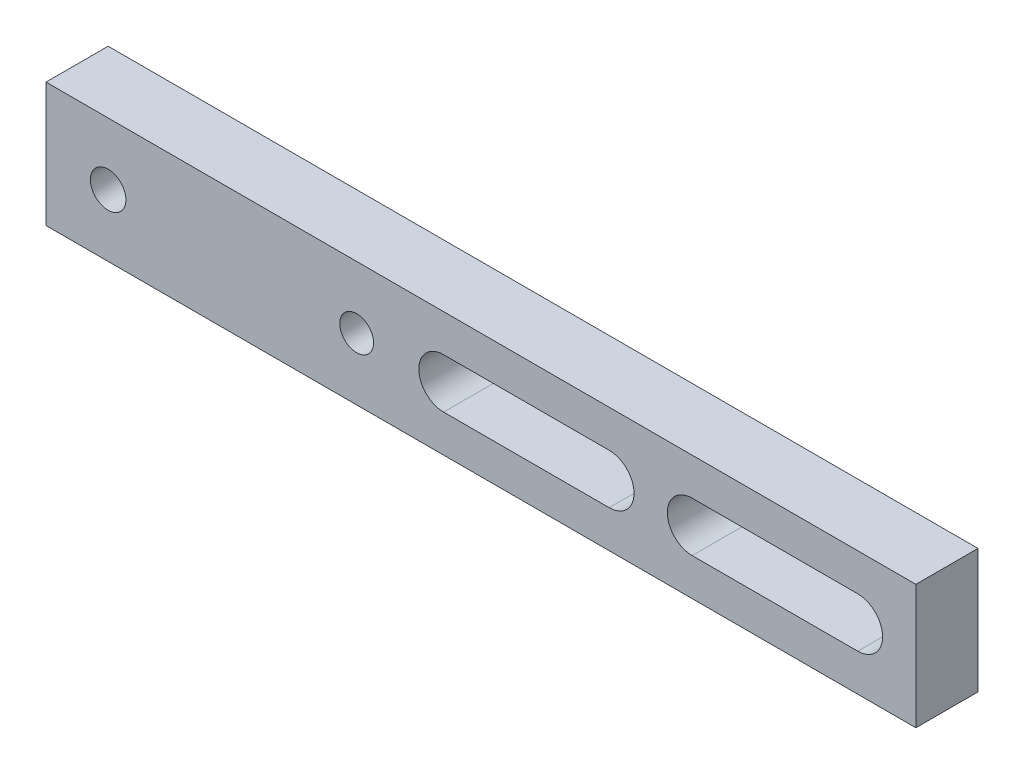
ISO-10303-21;
HEADER;
FILE_DESCRIPTION(('STEP AP214'),'2;1');
FILE_NAME('part.step','',(''),(''),'','','');
FILE_SCHEMA(('AUTOMOTIVE_DESIGN { 1 0 10303 214 1 1 1 1 }'));
ENDSEC;
DATA;
#1=APPLICATION_CONTEXT('core data for automotive mechanical design processes');
#2=APPLICATION_PROTOCOL_DEFINITION('international standard','automotive_design',2000,#1);
#3=PRODUCT_CONTEXT('',#1,'mechanical');
#4=PRODUCT('Part','Part','',(#3));
#5=PRODUCT_RELATED_PRODUCT_CATEGORY('part','',(#4));
#6=PRODUCT_DEFINITION_FORMATION('','',#4);
#7=PRODUCT_DEFINITION_CONTEXT('part definition',#1,'design');
#8=PRODUCT_DEFINITION('design','',#6,#7);
#9=PRODUCT_DEFINITION_SHAPE('','',#8);
#10=(LENGTH_UNIT() NAMED_UNIT(*) SI_UNIT(.MILLI.,.METRE.));
#11=(NAMED_UNIT(*) PLANE_ANGLE_UNIT() SI_UNIT($,.RADIAN.));
#12=(NAMED_UNIT(*) SI_UNIT($,.STERADIAN.) SOLID_ANGLE_UNIT());
#13=UNCERTAINTY_MEASURE_WITH_UNIT(LENGTH_MEASURE(1.E-05),#10,'distance_accuracy_value','');
#14=(GEOMETRIC_REPRESENTATION_CONTEXT(3) GLOBAL_UNCERTAINTY_ASSIGNED_CONTEXT((#13)) GLOBAL_UNIT_ASSIGNED_CONTEXT((#10,
#11,#12)) REPRESENTATION_CONTEXT('',''));
#15=CARTESIAN_POINT('',(0.,0.,0.));
#16=DIRECTION('',(0.,0.,1.));
#17=DIRECTION('',(1.,0.,0.));
#18=AXIS2_PLACEMENT_3D('',#15,#16,#17);
#19=CARTESIAN_POINT('',(-10.2152173913044,18.6358695652173,6.35));
#20=DIRECTION('',(1.,0.,0.));
#21=DIRECTION('',(0.,0.,-1.));
#22=AXIS2_PLACEMENT_3D('',#19,#20,#21);
#23=PLANE('',#22);
#24=DIRECTION('',(0.,-1.,0.));
#25=VECTOR('',#24,1.);
#26=CARTESIAN_POINT('',(-10.2152173913044,18.6358695652173,0.));
#27=LINE('',#26,#25);
#28=CARTESIAN_POINT('',(-10.2152173913044,18.6358695652173,0.));
#29=VERTEX_POINT('',#28);
#30=CARTESIAN_POINT('',(-10.2152173913044,5.93586956521734,0.));
#31=VERTEX_POINT('',#30);
#32=EDGE_CURVE('E162',#29,#31,#27,.T.);
#33=ORIENTED_EDGE('',*,*,#32,.T.);
#34=DIRECTION('',(0.,0.,-1.));
#35=VECTOR('',#34,1.);
#36=CARTESIAN_POINT('',(-10.2152173913044,5.93586956521734,6.35));
#37=LINE('',#36,#35);
#38=CARTESIAN_POINT('',(-10.2152173913044,5.93586956521734,6.35));
#39=VERTEX_POINT('',#38);
#40=EDGE_CURVE('E11',#39,#31,#37,.T.);
#41=ORIENTED_EDGE('',*,*,#40,.F.);
#42=DIRECTION('',(0.,-1.,0.));
#43=VECTOR('',#42,1.);
#44=CARTESIAN_POINT('',(-10.2152173913044,18.6358695652173,6.35));
#45=LINE('',#44,#43);
#46=CARTESIAN_POINT('',(-10.2152173913044,18.6358695652173,6.35));
#47=VERTEX_POINT('',#46);
#48=EDGE_CURVE('E207',#47,#39,#45,.T.);
#49=ORIENTED_EDGE('',*,*,#48,.F.);
#50=DIRECTION('',(0.,0.,-1.));
#51=VECTOR('',#50,1.);
#52=CARTESIAN_POINT('',(-10.2152173913044,18.6358695652173,6.35));
#53=LINE('',#52,#51);
#54=EDGE_CURVE('E217',#47,#29,#53,.T.);
#55=ORIENTED_EDGE('',*,*,#54,.T.);
#56=EDGE_LOOP('',(#33,#41,#49,#55));
#57=FACE_BOUND('',#56,.T.);
#58=ADVANCED_FACE('F37',(#57),#23,.F.);
#59=CARTESIAN_POINT('',(-10.2152173913044,5.93586956521734,6.35));
#60=DIRECTION('',(0.,1.,0.));
#61=DIRECTION('',(0.,0.,1.));
#62=AXIS2_PLACEMENT_3D('',#59,#60,#61);
#63=PLANE('',#62);
#64=DIRECTION('',(1.,0.,0.));
#65=VECTOR('',#64,1.);
#66=CARTESIAN_POINT('',(-10.2152173913044,5.93586956521734,0.));
#67=LINE('',#66,#65);
#68=CARTESIAN_POINT('',(78.6847826086956,5.93586956521734,0.));
#69=VERTEX_POINT('',#68);
#70=EDGE_CURVE('E220',#31,#69,#67,.T.);
#71=ORIENTED_EDGE('',*,*,#70,.T.);
#72=DIRECTION('',(0.,0.,-1.));
#73=VECTOR('',#72,1.);
#74=CARTESIAN_POINT('',(78.6847826086956,5.93586956521734,6.35));
#75=LINE('',#74,#73);
#76=CARTESIAN_POINT('',(78.6847826086956,5.93586956521734,6.35));
#77=VERTEX_POINT('',#76);
#78=EDGE_CURVE('E44',#77,#69,#75,.T.);
#79=ORIENTED_EDGE('',*,*,#78,.F.);
#80=DIRECTION('',(1.,0.,0.));
#81=VECTOR('',#80,1.);
#82=CARTESIAN_POINT('',(-10.2152173913044,5.93586956521734,6.35));
#83=LINE('',#82,#81);
#84=EDGE_CURVE('E210',#39,#77,#83,.T.);
#85=ORIENTED_EDGE('',*,*,#84,.F.);
#86=ORIENTED_EDGE('',*,*,#40,.T.);
#87=EDGE_LOOP('',(#71,#79,#85,#86));
#88=FACE_BOUND('',#87,.T.);
#89=ADVANCED_FACE('F249',(#88),#63,.F.);
#90=CARTESIAN_POINT('',(78.6847826086956,18.6358695652173,6.35));
#91=DIRECTION('',(-1.,0.,0.));
#92=DIRECTION('',(0.,0.,1.));
#93=AXIS2_PLACEMENT_3D('',#90,#91,#92);
#94=PLANE('',#93);
#95=DIRECTION('',(0.,1.,0.));
#96=VECTOR('',#95,1.);
#97=CARTESIAN_POINT('',(78.6847826086956,18.6358695652173,0.));
#98=LINE('',#97,#96);
#99=CARTESIAN_POINT('',(78.6847826086956,18.6358695652173,0.));
#100=VERTEX_POINT('',#99);
#101=EDGE_CURVE('E222',#69,#100,#98,.T.);
#102=ORIENTED_EDGE('',*,*,#101,.T.);
#103=DIRECTION('',(0.,0.,-1.));
#104=VECTOR('',#103,1.);
#105=CARTESIAN_POINT('',(78.6847826086956,18.6358695652173,6.35));
#106=LINE('',#105,#104);
#107=CARTESIAN_POINT('',(78.6847826086956,18.6358695652173,6.35));
#108=VERTEX_POINT('',#107);
#109=EDGE_CURVE('E227',#108,#100,#106,.T.);
#110=ORIENTED_EDGE('',*,*,#109,.F.);
#111=DIRECTION('',(0.,1.,0.));
#112=VECTOR('',#111,1.);
#113=CARTESIAN_POINT('',(78.6847826086956,18.6358695652173,6.35));
#114=LINE('',#113,#112);
#115=EDGE_CURVE('E213',#77,#108,#114,.T.);
#116=ORIENTED_EDGE('',*,*,#115,.F.);
#117=ORIENTED_EDGE('',*,*,#78,.T.);
#118=EDGE_LOOP('',(#102,#110,#116,#117));
#119=FACE_BOUND('',#118,.T.);
#120=ADVANCED_FACE('F234',(#119),#94,.F.);
#121=CARTESIAN_POINT('',(-10.2152173913044,18.6358695652173,6.35));
#122=DIRECTION('',(0.,-1.,0.));
#123=DIRECTION('',(0.,0.,-1.));
#124=AXIS2_PLACEMENT_3D('',#121,#122,#123);
#125=PLANE('',#124);
#126=DIRECTION('',(-1.,0.,0.));
#127=VECTOR('',#126,1.);
#128=CARTESIAN_POINT('',(-10.2152173913044,18.6358695652173,0.));
#129=LINE('',#128,#127);
#130=EDGE_CURVE('E211',#100,#29,#129,.T.);
#131=ORIENTED_EDGE('',*,*,#130,.T.);
#132=ORIENTED_EDGE('',*,*,#54,.F.);
#133=DIRECTION('',(-1.,0.,0.));
#134=VECTOR('',#133,1.);
#135=CARTESIAN_POINT('',(-10.2152173913044,18.6358695652173,6.35));
#136=LINE('',#135,#134);
#137=EDGE_CURVE('E215',#108,#47,#136,.T.);
#138=ORIENTED_EDGE('',*,*,#137,.F.);
#139=ORIENTED_EDGE('',*,*,#109,.T.);
#140=EDGE_LOOP('',(#131,#132,#138,#139));
#141=FACE_BOUND('',#140,.T.);
#142=ADVANCED_FACE('F242',(#141),#125,.F.);
#143=CARTESIAN_POINT('',(0.,0.,6.35));
#144=DIRECTION('',(0.,0.,1.));
#145=DIRECTION('',(1.,0.,0.));
#146=AXIS2_PLACEMENT_3D('',#143,#144,#145);
#147=PLANE('',#146);
#148=CARTESIAN_POINT('',(55.8247826086956,12.2858695652173,6.35));
#149=DIRECTION('',(0.,0.,1.));
#150=DIRECTION('',(1.,0.,0.));
#151=AXIS2_PLACEMENT_3D('',#148,#149,#150);
#152=CIRCLE('',#151,2.54);
#153=CARTESIAN_POINT('',(55.8247826086956,14.8258695652173,6.35));
#154=VERTEX_POINT('',#153);
#155=CARTESIAN_POINT('',(55.8247826086956,9.74586956521734,6.35));
#156=VERTEX_POINT('',#155);
#157=EDGE_CURVE('E51',#154,#156,#152,.T.);
#158=ORIENTED_EDGE('',*,*,#157,.F.);
#159=DIRECTION('',(-1.,0.,0.));
#160=VECTOR('',#159,1.);
#161=CARTESIAN_POINT('',(55.8247826086956,14.8258695652173,6.35));
#162=LINE('',#161,#160);
#163=CARTESIAN_POINT('',(72.7411826086957,14.8258695652173,6.35));
#164=VERTEX_POINT('',#163);
#165=EDGE_CURVE('E146',#164,#154,#162,.T.);
#166=ORIENTED_EDGE('',*,*,#165,.F.);
#167=CARTESIAN_POINT('',(72.7411826086956,12.2858695652173,6.35));
#168=DIRECTION('',(0.,0.,1.));
#169=DIRECTION('',(1.,0.,0.));
#170=AXIS2_PLACEMENT_3D('',#167,#168,#169);
#171=CIRCLE('',#170,2.54);
#172=CARTESIAN_POINT('',(72.7411826086957,9.74586956521734,6.35));
#173=VERTEX_POINT('',#172);
#174=EDGE_CURVE('E149',#173,#164,#171,.T.);
#175=ORIENTED_EDGE('',*,*,#174,.F.);
#176=DIRECTION('',(1.,0.,0.));
#177=VECTOR('',#176,1.);
#178=CARTESIAN_POINT('',(55.8247826086956,9.74586956521734,6.35));
#179=LINE('',#178,#177);
#180=EDGE_CURVE('E155',#156,#173,#179,.T.);
#181=ORIENTED_EDGE('',*,*,#180,.F.);
#182=EDGE_LOOP('',(#158,#166,#175,#181));
#183=FACE_BOUND('',#182,.T.);
#184=CARTESIAN_POINT('',(47.3411826086956,12.2858695652173,6.35));
#185=DIRECTION('',(0.,0.,1.));
#186=DIRECTION('',(1.,0.,0.));
#187=AXIS2_PLACEMENT_3D('',#184,#185,#186);
#188=CIRCLE('',#187,2.54);
#189=CARTESIAN_POINT('',(47.3411826086956,9.74586956521734,6.35));
#190=VERTEX_POINT('',#189);
#191=CARTESIAN_POINT('',(47.3411826086956,14.8258695652173,6.35));
#192=VERTEX_POINT('',#191);
#193=EDGE_CURVE('E59',#190,#192,#188,.T.);
#194=ORIENTED_EDGE('',*,*,#193,.F.);
#195=DIRECTION('',(1.,0.,0.));
#196=VECTOR('',#195,1.);
#197=CARTESIAN_POINT('',(47.3411826086956,9.74586956521734,6.35));
#198=LINE('',#197,#196);
#199=CARTESIAN_POINT('',(30.4247826086956,9.74586956521734,6.35));
#200=VERTEX_POINT('',#199);
#201=EDGE_CURVE('E170',#200,#190,#198,.T.);
#202=ORIENTED_EDGE('',*,*,#201,.F.);
#203=CARTESIAN_POINT('',(30.4247826086956,12.2858695652173,6.35));
#204=DIRECTION('',(0.,0.,1.));
#205=DIRECTION('',(1.,0.,0.));
#206=AXIS2_PLACEMENT_3D('',#203,#204,#205);
#207=CIRCLE('',#206,2.54);
#208=CARTESIAN_POINT('',(30.4247826086956,14.8258695652173,6.35));
#209=VERTEX_POINT('',#208);
#210=EDGE_CURVE('E185',#209,#200,#207,.T.);
#211=ORIENTED_EDGE('',*,*,#210,.F.);
#212=DIRECTION('',(-1.,0.,0.));
#213=VECTOR('',#212,1.);
#214=CARTESIAN_POINT('',(47.3411826086956,14.8258695652173,6.35));
#215=LINE('',#214,#213);
#216=EDGE_CURVE('E181',#192,#209,#215,.T.);
#217=ORIENTED_EDGE('',*,*,#216,.F.);
#218=EDGE_LOOP('',(#194,#202,#211,#217));
#219=FACE_BOUND('',#218,.T.);
#220=CARTESIAN_POINT('',(21.5347826086956,12.2858695652173,6.35));
#221=DIRECTION('',(0.,0.,1.));
#222=DIRECTION('',(1.,0.,0.));
#223=AXIS2_PLACEMENT_3D('',#220,#221,#222);
#224=CIRCLE('',#223,1.72948242100636);
#225=CARTESIAN_POINT('',(23.264265029702,12.2858695652173,6.35));
#226=VERTEX_POINT('',#225);
#227=EDGE_CURVE('E198',#226,#226,#224,.T.);
#228=ORIENTED_EDGE('',*,*,#227,.F.);
#229=EDGE_LOOP('',(#228));
#230=FACE_BOUND('',#229,.T.);
#231=CARTESIAN_POINT('',(-3.86521739130436,12.2858695652173,6.35));
#232=DIRECTION('',(0.,0.,1.));
#233=DIRECTION('',(1.,0.,0.));
#234=AXIS2_PLACEMENT_3D('',#231,#232,#233);
#235=CIRCLE('',#234,1.81622430181221);
#236=CARTESIAN_POINT('',(-2.04899308949215,12.2858695652173,6.35));
#237=VERTEX_POINT('',#236);
#238=EDGE_CURVE('E204',#237,#237,#235,.T.);
#239=ORIENTED_EDGE('',*,*,#238,.F.);
#240=EDGE_LOOP('',(#239));
#241=FACE_BOUND('',#240,.T.);
#242=ORIENTED_EDGE('',*,*,#48,.T.);
#243=ORIENTED_EDGE('',*,*,#84,.T.);
#244=ORIENTED_EDGE('',*,*,#115,.T.);
#245=ORIENTED_EDGE('',*,*,#137,.T.);
#246=EDGE_LOOP('',(#242,#243,#244,#245));
#247=FACE_BOUND('',#246,.T.);
#248=ADVANCED_FACE('F248',(#183,#219,#230,#241,#247),#147,.T.);
#249=CARTESIAN_POINT('',(0.,0.,0.));
#250=DIRECTION('',(0.,0.,1.));
#251=DIRECTION('',(1.,0.,0.));
#252=AXIS2_PLACEMENT_3D('',#249,#250,#251);
#253=PLANE('',#252);
#254=DIRECTION('',(-1.,0.,0.));
#255=VECTOR('',#254,1.);
#256=CARTESIAN_POINT('',(55.8247826086956,14.8258695652173,0.));
#257=LINE('',#256,#255);
#258=CARTESIAN_POINT('',(72.7411826086957,14.8258695652173,0.));
#259=VERTEX_POINT('',#258);
#260=CARTESIAN_POINT('',(55.8247826086956,14.8258695652173,0.));
#261=VERTEX_POINT('',#260);
#262=EDGE_CURVE('E133',#259,#261,#257,.T.);
#263=ORIENTED_EDGE('',*,*,#262,.T.);
#264=CARTESIAN_POINT('',(55.8247826086956,12.2858695652173,0.));
#265=DIRECTION('',(0.,0.,1.));
#266=DIRECTION('',(1.,0.,0.));
#267=AXIS2_PLACEMENT_3D('',#264,#265,#266);
#268=CIRCLE('',#267,2.54);
#269=CARTESIAN_POINT('',(55.8247826086956,9.74586956521734,0.));
#270=VERTEX_POINT('',#269);
#271=EDGE_CURVE('E127',#261,#270,#268,.T.);
#272=ORIENTED_EDGE('',*,*,#271,.T.);
#273=DIRECTION('',(1.,0.,0.));
#274=VECTOR('',#273,1.);
#275=CARTESIAN_POINT('',(55.8247826086956,9.74586956521734,0.));
#276=LINE('',#275,#274);
#277=CARTESIAN_POINT('',(72.7411826086957,9.74586956521734,0.));
#278=VERTEX_POINT('',#277);
#279=EDGE_CURVE('E137',#270,#278,#276,.T.);
#280=ORIENTED_EDGE('',*,*,#279,.T.);
#281=CARTESIAN_POINT('',(72.7411826086956,12.2858695652173,0.));
#282=DIRECTION('',(0.,0.,1.));
#283=DIRECTION('',(1.,0.,0.));
#284=AXIS2_PLACEMENT_3D('',#281,#282,#283);
#285=CIRCLE('',#284,2.54);
#286=EDGE_CURVE('E141',#278,#259,#285,.T.);
#287=ORIENTED_EDGE('',*,*,#286,.T.);
#288=EDGE_LOOP('',(#263,#272,#280,#287));
#289=FACE_BOUND('',#288,.T.);
#290=DIRECTION('',(1.,0.,0.));
#291=VECTOR('',#290,1.);
#292=CARTESIAN_POINT('',(47.3411826086956,9.74586956521734,0.));
#293=LINE('',#292,#291);
#294=CARTESIAN_POINT('',(30.4247826086956,9.74586956521734,0.));
#295=VERTEX_POINT('',#294);
#296=CARTESIAN_POINT('',(47.3411826086956,9.74586956521734,0.));
#297=VERTEX_POINT('',#296);
#298=EDGE_CURVE('E176',#295,#297,#293,.T.);
#299=ORIENTED_EDGE('',*,*,#298,.T.);
#300=CARTESIAN_POINT('',(47.3411826086956,12.2858695652173,0.));
#301=DIRECTION('',(0.,0.,1.));
#302=DIRECTION('',(1.,0.,0.));
#303=AXIS2_PLACEMENT_3D('',#300,#301,#302);
#304=CIRCLE('',#303,2.54);
#305=CARTESIAN_POINT('',(47.3411826086956,14.8258695652173,0.));
#306=VERTEX_POINT('',#305);
#307=EDGE_CURVE('E166',#297,#306,#304,.T.);
#308=ORIENTED_EDGE('',*,*,#307,.T.);
#309=DIRECTION('',(-1.,0.,0.));
#310=VECTOR('',#309,1.);
#311=CARTESIAN_POINT('',(47.3411826086956,14.8258695652173,0.));
#312=LINE('',#311,#310);
#313=CARTESIAN_POINT('',(30.4247826086956,14.8258695652173,0.));
#314=VERTEX_POINT('',#313);
#315=EDGE_CURVE('E169',#306,#314,#312,.T.);
#316=ORIENTED_EDGE('',*,*,#315,.T.);
#317=CARTESIAN_POINT('',(30.4247826086956,12.2858695652173,0.));
#318=DIRECTION('',(0.,0.,1.));
#319=DIRECTION('',(1.,0.,0.));
#320=AXIS2_PLACEMENT_3D('',#317,#318,#319);
#321=CIRCLE('',#320,2.54);
#322=EDGE_CURVE('E173',#314,#295,#321,.T.);
#323=ORIENTED_EDGE('',*,*,#322,.T.);
#324=EDGE_LOOP('',(#299,#308,#316,#323));
#325=FACE_BOUND('',#324,.T.);
#326=CARTESIAN_POINT('',(21.5347826086956,12.2858695652173,0.));
#327=DIRECTION('',(0.,0.,1.));
#328=DIRECTION('',(1.,0.,0.));
#329=AXIS2_PLACEMENT_3D('',#326,#327,#328);
#330=CIRCLE('',#329,1.72948242100636);
#331=CARTESIAN_POINT('',(23.264265029702,12.2858695652173,0.));
#332=VERTEX_POINT('',#331);
#333=EDGE_CURVE('E182',#332,#332,#330,.T.);
#334=ORIENTED_EDGE('',*,*,#333,.T.);
#335=EDGE_LOOP('',(#334));
#336=FACE_BOUND('',#335,.T.);
#337=CARTESIAN_POINT('',(-3.86521739130436,12.2858695652173,0.));
#338=DIRECTION('',(0.,0.,1.));
#339=DIRECTION('',(1.,0.,0.));
#340=AXIS2_PLACEMENT_3D('',#337,#338,#339);
#341=CIRCLE('',#340,1.81622430181221);
#342=CARTESIAN_POINT('',(-2.04899308949215,12.2858695652173,0.));
#343=VERTEX_POINT('',#342);
#344=EDGE_CURVE('E201',#343,#343,#341,.T.);
#345=ORIENTED_EDGE('',*,*,#344,.T.);
#346=EDGE_LOOP('',(#345));
#347=FACE_BOUND('',#346,.T.);
#348=ORIENTED_EDGE('',*,*,#32,.F.);
#349=ORIENTED_EDGE('',*,*,#130,.F.);
#350=ORIENTED_EDGE('',*,*,#101,.F.);
#351=ORIENTED_EDGE('',*,*,#70,.F.);
#352=EDGE_LOOP('',(#348,#349,#350,#351));
#353=FACE_BOUND('',#352,.T.);
#354=ADVANCED_FACE('F143',(#289,#325,#336,#347,#353),#253,.F.);
#355=CARTESIAN_POINT('',(-3.86521739130436,12.2858695652173,0.));
#356=DIRECTION('',(0.,0.,1.));
#357=DIRECTION('',(1.,0.,0.));
#358=AXIS2_PLACEMENT_3D('',#355,#356,#357);
#359=CYLINDRICAL_SURFACE('',#358,1.81622430181221);
#360=ORIENTED_EDGE('',*,*,#344,.F.);
#361=EDGE_LOOP('',(#360));
#362=FACE_BOUND('',#361,.T.);
#363=ORIENTED_EDGE('',*,*,#238,.T.);
#364=EDGE_LOOP('',(#363));
#365=FACE_BOUND('',#364,.T.);
#366=ADVANCED_FACE('F261',(#362,#365),#359,.F.);
#367=CARTESIAN_POINT('',(21.5347826086956,12.2858695652173,0.));
#368=DIRECTION('',(0.,0.,1.));
#369=DIRECTION('',(1.,0.,0.));
#370=AXIS2_PLACEMENT_3D('',#367,#368,#369);
#371=CYLINDRICAL_SURFACE('',#370,1.72948242100636);
#372=ORIENTED_EDGE('',*,*,#333,.F.);
#373=EDGE_LOOP('',(#372));
#374=FACE_BOUND('',#373,.T.);
#375=ORIENTED_EDGE('',*,*,#227,.T.);
#376=EDGE_LOOP('',(#375));
#377=FACE_BOUND('',#376,.T.);
#378=ADVANCED_FACE('F267',(#374,#377),#371,.F.);
#379=CARTESIAN_POINT('',(47.3411826086956,12.2858695652173,0.));
#380=DIRECTION('',(0.,0.,1.));
#381=DIRECTION('',(1.,0.,0.));
#382=AXIS2_PLACEMENT_3D('',#379,#380,#381);
#383=CYLINDRICAL_SURFACE('',#382,2.54);
#384=ORIENTED_EDGE('',*,*,#193,.T.);
#385=DIRECTION('',(0.,0.,1.));
#386=VECTOR('',#385,1.);
#387=CARTESIAN_POINT('',(47.3411826086956,14.8258695652173,0.));
#388=LINE('',#387,#386);
#389=EDGE_CURVE('E179',#306,#192,#388,.T.);
#390=ORIENTED_EDGE('',*,*,#389,.F.);
#391=ORIENTED_EDGE('',*,*,#307,.F.);
#392=DIRECTION('',(0.,0.,1.));
#393=VECTOR('',#392,1.);
#394=CARTESIAN_POINT('',(47.3411826086956,9.74586956521734,0.));
#395=LINE('',#394,#393);
#396=EDGE_CURVE('E156',#297,#190,#395,.T.);
#397=ORIENTED_EDGE('',*,*,#396,.T.);
#398=EDGE_LOOP('',(#384,#390,#391,#397));
#399=FACE_BOUND('',#398,.T.);
#400=ADVANCED_FACE('F271',(#399),#383,.F.);
#401=CARTESIAN_POINT('',(47.3411826086956,9.74586956521734,0.));
#402=DIRECTION('',(0.,-1.,0.));
#403=DIRECTION('',(0.,0.,-1.));
#404=AXIS2_PLACEMENT_3D('',#401,#402,#403);
#405=PLANE('',#404);
#406=ORIENTED_EDGE('',*,*,#201,.T.);
#407=ORIENTED_EDGE('',*,*,#396,.F.);
#408=ORIENTED_EDGE('',*,*,#298,.F.);
#409=DIRECTION('',(0.,0.,1.));
#410=VECTOR('',#409,1.);
#411=CARTESIAN_POINT('',(30.4247826086956,9.74586956521734,0.));
#412=LINE('',#411,#410);
#413=EDGE_CURVE('E191',#295,#200,#412,.T.);
#414=ORIENTED_EDGE('',*,*,#413,.T.);
#415=EDGE_LOOP('',(#406,#407,#408,#414));
#416=FACE_BOUND('',#415,.T.);
#417=ADVANCED_FACE('F275',(#416),#405,.F.);
#418=CARTESIAN_POINT('',(30.4247826086956,12.2858695652173,0.));
#419=DIRECTION('',(0.,0.,1.));
#420=DIRECTION('',(1.,0.,0.));
#421=AXIS2_PLACEMENT_3D('',#418,#419,#420);
#422=CYLINDRICAL_SURFACE('',#421,2.54);
#423=ORIENTED_EDGE('',*,*,#210,.T.);
#424=ORIENTED_EDGE('',*,*,#413,.F.);
#425=ORIENTED_EDGE('',*,*,#322,.F.);
#426=DIRECTION('',(0.,0.,1.));
#427=VECTOR('',#426,1.);
#428=CARTESIAN_POINT('',(30.4247826086956,14.8258695652173,0.));
#429=LINE('',#428,#427);
#430=EDGE_CURVE('E193',#314,#209,#429,.T.);
#431=ORIENTED_EDGE('',*,*,#430,.T.);
#432=EDGE_LOOP('',(#423,#424,#425,#431));
#433=FACE_BOUND('',#432,.T.);
#434=ADVANCED_FACE('F279',(#433),#422,.F.);
#435=CARTESIAN_POINT('',(47.3411826086956,14.8258695652173,0.));
#436=DIRECTION('',(0.,1.,0.));
#437=DIRECTION('',(-1.,0.,0.));
#438=AXIS2_PLACEMENT_3D('',#435,#436,#437);
#439=PLANE('',#438);
#440=ORIENTED_EDGE('',*,*,#216,.T.);
#441=ORIENTED_EDGE('',*,*,#430,.F.);
#442=ORIENTED_EDGE('',*,*,#315,.F.);
#443=ORIENTED_EDGE('',*,*,#389,.T.);
#444=EDGE_LOOP('',(#440,#441,#442,#443));
#445=FACE_BOUND('',#444,.T.);
#446=ADVANCED_FACE('F276',(#445),#439,.F.);
#447=CARTESIAN_POINT('',(55.8247826086956,12.2858695652173,0.));
#448=DIRECTION('',(0.,0.,1.));
#449=DIRECTION('',(1.,0.,0.));
#450=AXIS2_PLACEMENT_3D('',#447,#448,#449);
#451=CYLINDRICAL_SURFACE('',#450,2.54);
#452=ORIENTED_EDGE('',*,*,#157,.T.);
#453=DIRECTION('',(0.,0.,1.));
#454=VECTOR('',#453,1.);
#455=CARTESIAN_POINT('',(55.8247826086956,9.74586956521734,0.));
#456=LINE('',#455,#454);
#457=EDGE_CURVE('E123',#270,#156,#456,.T.);
#458=ORIENTED_EDGE('',*,*,#457,.F.);
#459=ORIENTED_EDGE('',*,*,#271,.F.);
#460=DIRECTION('',(0.,0.,1.));
#461=VECTOR('',#460,1.);
#462=CARTESIAN_POINT('',(55.8247826086956,14.8258695652173,0.));
#463=LINE('',#462,#461);
#464=EDGE_CURVE('E160',#261,#154,#463,.T.);
#465=ORIENTED_EDGE('',*,*,#464,.T.);
#466=EDGE_LOOP('',(#452,#458,#459,#465));
#467=FACE_BOUND('',#466,.T.);
#468=ADVANCED_FACE('F125',(#467),#451,.F.);
#469=CARTESIAN_POINT('',(55.8247826086956,14.8258695652173,0.));
#470=DIRECTION('',(0.,1.,0.));
#471=DIRECTION('',(-1.,0.,0.));
#472=AXIS2_PLACEMENT_3D('',#469,#470,#471);
#473=PLANE('',#472);
#474=ORIENTED_EDGE('',*,*,#165,.T.);
#475=ORIENTED_EDGE('',*,*,#464,.F.);
#476=ORIENTED_EDGE('',*,*,#262,.F.);
#477=DIRECTION('',(0.,0.,1.));
#478=VECTOR('',#477,1.);
#479=CARTESIAN_POINT('',(72.7411826086957,14.8258695652173,0.));
#480=LINE('',#479,#478);
#481=EDGE_CURVE('E163',#259,#164,#480,.T.);
#482=ORIENTED_EDGE('',*,*,#481,.T.);
#483=EDGE_LOOP('',(#474,#475,#476,#482));
#484=FACE_BOUND('',#483,.T.);
#485=ADVANCED_FACE('F289',(#484),#473,.F.);
#486=CARTESIAN_POINT('',(72.7411826086956,12.2858695652173,0.));
#487=DIRECTION('',(0.,0.,1.));
#488=DIRECTION('',(1.,0.,0.));
#489=AXIS2_PLACEMENT_3D('',#486,#487,#488);
#490=CYLINDRICAL_SURFACE('',#489,2.54);
#491=ORIENTED_EDGE('',*,*,#174,.T.);
#492=ORIENTED_EDGE('',*,*,#481,.F.);
#493=ORIENTED_EDGE('',*,*,#286,.F.);
#494=DIRECTION('',(0.,0.,1.));
#495=VECTOR('',#494,1.);
#496=CARTESIAN_POINT('',(72.7411826086957,9.74586956521734,0.));
#497=LINE('',#496,#495);
#498=EDGE_CURVE('E132',#278,#173,#497,.T.);
#499=ORIENTED_EDGE('',*,*,#498,.T.);
#500=EDGE_LOOP('',(#491,#492,#493,#499));
#501=FACE_BOUND('',#500,.T.);
#502=ADVANCED_FACE('F292',(#501),#490,.F.);
#503=CARTESIAN_POINT('',(55.8247826086956,9.74586956521734,0.));
#504=DIRECTION('',(0.,-1.,0.));
#505=DIRECTION('',(1.,0.,0.));
#506=AXIS2_PLACEMENT_3D('',#503,#504,#505);
#507=PLANE('',#506);
#508=ORIENTED_EDGE('',*,*,#180,.T.);
#509=ORIENTED_EDGE('',*,*,#498,.F.);
#510=ORIENTED_EDGE('',*,*,#279,.F.);
#511=ORIENTED_EDGE('',*,*,#457,.T.);
#512=EDGE_LOOP('',(#508,#509,#510,#511));
#513=FACE_BOUND('',#512,.T.);
#514=ADVANCED_FACE('F138',(#513),#507,.F.);
#515=CLOSED_SHELL('',(#58,#89,#120,#142,#248,#354,#366,#378,#400,#417,#434,#446,#468,#485,#502,#514));
#516=MANIFOLD_SOLID_BREP('B2',#515);
#517=ADVANCED_BREP_SHAPE_REPRESENTATION('',(#18,#516),#14);
#518=SHAPE_DEFINITION_REPRESENTATION(#9,#517);
ENDSEC;
END-ISO-10303-21;
